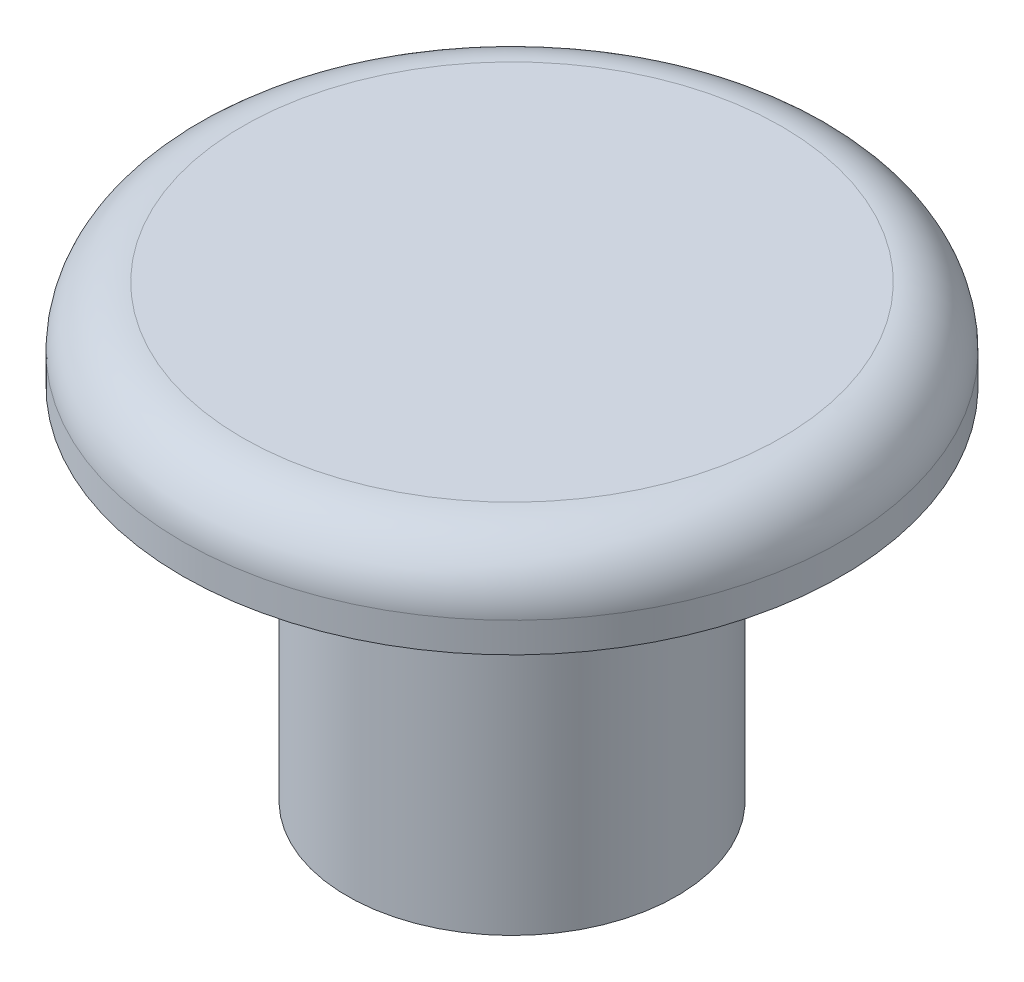
ISO-10303-21;
HEADER;
FILE_DESCRIPTION(('STEP AP214'),'2;1');
FILE_NAME('part.step','',(''),(''),'','','');
FILE_SCHEMA(('AUTOMOTIVE_DESIGN { 1 0 10303 214 1 1 1 1 }'));
ENDSEC;
DATA;
#1=APPLICATION_CONTEXT('core data for automotive mechanical design processes');
#2=APPLICATION_PROTOCOL_DEFINITION('international standard','automotive_design',2000,#1);
#3=PRODUCT_CONTEXT('',#1,'mechanical');
#4=PRODUCT('Part','Part','',(#3));
#5=PRODUCT_RELATED_PRODUCT_CATEGORY('part','',(#4));
#6=PRODUCT_DEFINITION_FORMATION('','',#4);
#7=PRODUCT_DEFINITION_CONTEXT('part definition',#1,'design');
#8=PRODUCT_DEFINITION('design','',#6,#7);
#9=PRODUCT_DEFINITION_SHAPE('','',#8);
#10=(LENGTH_UNIT() NAMED_UNIT(*) SI_UNIT(.MILLI.,.METRE.));
#11=(NAMED_UNIT(*) PLANE_ANGLE_UNIT() SI_UNIT($,.RADIAN.));
#12=(NAMED_UNIT(*) SI_UNIT($,.STERADIAN.) SOLID_ANGLE_UNIT());
#13=UNCERTAINTY_MEASURE_WITH_UNIT(LENGTH_MEASURE(1.E-05),#10,'distance_accuracy_value','');
#14=(GEOMETRIC_REPRESENTATION_CONTEXT(3) GLOBAL_UNCERTAINTY_ASSIGNED_CONTEXT((#13)) GLOBAL_UNIT_ASSIGNED_CONTEXT((#10,
#11,#12)) REPRESENTATION_CONTEXT('',''));
#15=CARTESIAN_POINT('',(0.,0.,0.));
#16=DIRECTION('',(0.,0.,1.));
#17=DIRECTION('',(1.,0.,0.));
#18=AXIS2_PLACEMENT_3D('',#15,#16,#17);
#19=CARTESIAN_POINT('',(0.,3.,0.));
#20=DIRECTION('',(0.,-1.,0.));
#21=DIRECTION('',(0.,0.,-1.));
#22=AXIS2_PLACEMENT_3D('',#19,#20,#21);
#23=CYLINDRICAL_SURFACE('',#22,11.);
#24=CARTESIAN_POINT('',(0.,1.,0.));
#25=DIRECTION('',(0.,1.,0.));
#26=DIRECTION('',(0.,0.,1.));
#27=AXIS2_PLACEMENT_3D('',#24,#25,#26);
#28=CIRCLE('',#27,11.);
#29=CARTESIAN_POINT('',(0.,1.,11.));
#30=VERTEX_POINT('',#29);
#31=EDGE_CURVE('E39',#30,#30,#28,.F.);
#32=ORIENTED_EDGE('',*,*,#31,.T.);
#33=EDGE_LOOP('',(#32));
#34=FACE_BOUND('',#33,.T.);
#35=CARTESIAN_POINT('',(0.,0.,0.));
#36=DIRECTION('',(0.,1.,0.));
#37=DIRECTION('',(0.,0.,1.));
#38=AXIS2_PLACEMENT_3D('',#35,#36,#37);
#39=CIRCLE('',#38,11.);
#40=CARTESIAN_POINT('',(0.,0.,11.));
#41=VERTEX_POINT('',#40);
#42=EDGE_CURVE('E51',#41,#41,#39,.T.);
#43=ORIENTED_EDGE('',*,*,#42,.T.);
#44=EDGE_LOOP('',(#43));
#45=FACE_BOUND('',#44,.T.);
#46=ADVANCED_FACE('F35',(#34,#45),#23,.T.);
#47=CARTESIAN_POINT('',(0.,3.,0.));
#48=DIRECTION('',(0.,1.,0.));
#49=DIRECTION('',(0.,0.,1.));
#50=AXIS2_PLACEMENT_3D('',#47,#48,#49);
#51=PLANE('',#50);
#52=CARTESIAN_POINT('',(0.,3.,0.));
#53=DIRECTION('',(0.,1.,0.));
#54=DIRECTION('',(0.,0.,1.));
#55=AXIS2_PLACEMENT_3D('',#52,#53,#54);
#56=CIRCLE('',#55,9.);
#57=CARTESIAN_POINT('',(0.,3.,9.));
#58=VERTEX_POINT('',#57);
#59=EDGE_CURVE('E47',#58,#58,#56,.T.);
#60=ORIENTED_EDGE('',*,*,#59,.T.);
#61=EDGE_LOOP('',(#60));
#62=FACE_BOUND('',#61,.T.);
#63=ADVANCED_FACE('F56',(#62),#51,.T.);
#64=CARTESIAN_POINT('',(0.,0.,0.));
#65=DIRECTION('',(0.,1.,0.));
#66=DIRECTION('',(0.,0.,1.));
#67=AXIS2_PLACEMENT_3D('',#64,#65,#66);
#68=PLANE('',#67);
#69=CARTESIAN_POINT('',(0.,0.,0.));
#70=DIRECTION('',(0.,-1.,0.));
#71=DIRECTION('',(0.,0.,-1.));
#72=AXIS2_PLACEMENT_3D('',#69,#70,#71);
#73=CIRCLE('',#72,5.5);
#74=CARTESIAN_POINT('',(0.,0.,-5.5));
#75=VERTEX_POINT('',#74);
#76=EDGE_CURVE('E10',#75,#75,#73,.T.);
#77=ORIENTED_EDGE('',*,*,#76,.F.);
#78=EDGE_LOOP('',(#77));
#79=FACE_BOUND('',#78,.T.);
#80=ORIENTED_EDGE('',*,*,#42,.F.);
#81=EDGE_LOOP('',(#80));
#82=FACE_BOUND('',#81,.T.);
#83=ADVANCED_FACE('F60',(#79,#82),#68,.F.);
#84=CARTESIAN_POINT('',(0.,1.,0.));
#85=DIRECTION('',(0.,1.,0.));
#86=DIRECTION('',(0.,0.,1.));
#87=AXIS2_PLACEMENT_3D('',#84,#85,#86);
#88=TOROIDAL_SURFACE('',#87,9.,2.);
#89=ORIENTED_EDGE('',*,*,#31,.F.);
#90=EDGE_LOOP('',(#89));
#91=FACE_BOUND('',#90,.T.);
#92=ORIENTED_EDGE('',*,*,#59,.F.);
#93=EDGE_LOOP('',(#92));
#94=FACE_BOUND('',#93,.T.);
#95=ADVANCED_FACE('F37',(#91,#94),#88,.T.);
#96=CARTESIAN_POINT('',(0.,-12.,0.));
#97=DIRECTION('',(0.,1.,0.));
#98=DIRECTION('',(0.,0.,1.));
#99=AXIS2_PLACEMENT_3D('',#96,#97,#98);
#100=CYLINDRICAL_SURFACE('',#99,5.5);
#101=CARTESIAN_POINT('',(0.,-12.,0.));
#102=DIRECTION('',(0.,-1.,0.));
#103=DIRECTION('',(0.,0.,-1.));
#104=AXIS2_PLACEMENT_3D('',#101,#102,#103);
#105=CIRCLE('',#104,5.5);
#106=CARTESIAN_POINT('',(0.,-12.,-5.5));
#107=VERTEX_POINT('',#106);
#108=EDGE_CURVE('E50',#107,#107,#105,.T.);
#109=ORIENTED_EDGE('',*,*,#108,.F.);
#110=EDGE_LOOP('',(#109));
#111=FACE_BOUND('',#110,.T.);
#112=ORIENTED_EDGE('',*,*,#76,.T.);
#113=EDGE_LOOP('',(#112));
#114=FACE_BOUND('',#113,.T.);
#115=ADVANCED_FACE('F59',(#111,#114),#100,.T.);
#116=CARTESIAN_POINT('',(0.,-12.,0.));
#117=DIRECTION('',(0.,-1.,0.));
#118=DIRECTION('',(0.,0.,-1.));
#119=AXIS2_PLACEMENT_3D('',#116,#117,#118);
#120=PLANE('',#119);
#121=ORIENTED_EDGE('',*,*,#108,.T.);
#122=EDGE_LOOP('',(#121));
#123=FACE_BOUND('',#122,.T.);
#124=ADVANCED_FACE('F66',(#123),#120,.T.);
#125=CLOSED_SHELL('',(#46,#63,#83,#95,#115,#124));
#126=MANIFOLD_SOLID_BREP('B2',#125);
#127=ADVANCED_BREP_SHAPE_REPRESENTATION('',(#18,#126),#14);
#128=SHAPE_DEFINITION_REPRESENTATION(#9,#127);
ENDSEC;
END-ISO-10303-21;
